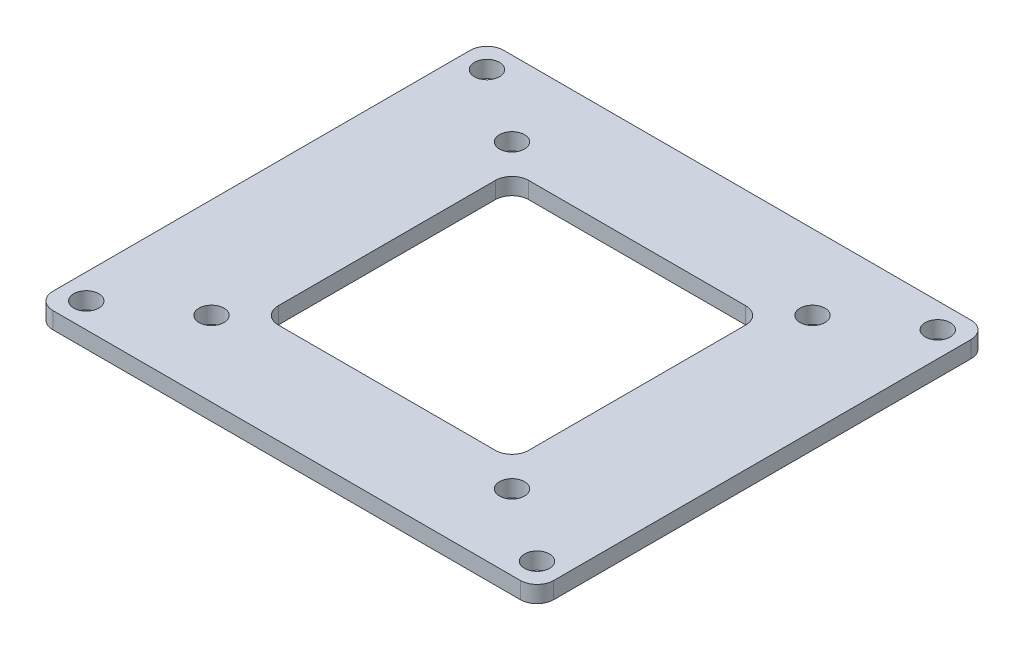
ISO-10303-21;
HEADER;
FILE_DESCRIPTION(('STEP AP214'),'2;1');
FILE_NAME('part.step','',(''),(''),'','','');
FILE_SCHEMA(('AUTOMOTIVE_DESIGN { 1 0 10303 214 1 1 1 1 }'));
ENDSEC;
DATA;
#1=APPLICATION_CONTEXT('core data for automotive mechanical design processes');
#2=APPLICATION_PROTOCOL_DEFINITION('international standard','automotive_design',2000,#1);
#3=PRODUCT_CONTEXT('',#1,'mechanical');
#4=PRODUCT('Part','Part','',(#3));
#5=PRODUCT_RELATED_PRODUCT_CATEGORY('part','',(#4));
#6=PRODUCT_DEFINITION_FORMATION('','',#4);
#7=PRODUCT_DEFINITION_CONTEXT('part definition',#1,'design');
#8=PRODUCT_DEFINITION('design','',#6,#7);
#9=PRODUCT_DEFINITION_SHAPE('','',#8);
#10=(LENGTH_UNIT() NAMED_UNIT(*) SI_UNIT(.MILLI.,.METRE.));
#11=(NAMED_UNIT(*) PLANE_ANGLE_UNIT() SI_UNIT($,.RADIAN.));
#12=(NAMED_UNIT(*) SI_UNIT($,.STERADIAN.) SOLID_ANGLE_UNIT());
#13=UNCERTAINTY_MEASURE_WITH_UNIT(LENGTH_MEASURE(1.E-05),#10,'distance_accuracy_value','');
#14=(GEOMETRIC_REPRESENTATION_CONTEXT(3) GLOBAL_UNCERTAINTY_ASSIGNED_CONTEXT((#13)) GLOBAL_UNIT_ASSIGNED_CONTEXT((#10,
#11,#12)) REPRESENTATION_CONTEXT('',''));
#15=CARTESIAN_POINT('',(0.,0.,0.));
#16=DIRECTION('',(0.,0.,1.));
#17=DIRECTION('',(1.,0.,0.));
#18=AXIS2_PLACEMENT_3D('',#15,#16,#17);
#19=CARTESIAN_POINT('',(0.,2.,0.));
#20=DIRECTION('',(0.,1.,0.));
#21=DIRECTION('',(0.,0.,1.));
#22=AXIS2_PLACEMENT_3D('',#19,#20,#21);
#23=PLANE('',#22);
#24=DIRECTION('',(0.,0.,-1.));
#25=VECTOR('',#24,1.);
#26=CARTESIAN_POINT('',(15.,2.,-15.));
#27=LINE('',#26,#25);
#28=CARTESIAN_POINT('',(15.,2.,13.));
#29=VERTEX_POINT('',#28);
#30=CARTESIAN_POINT('',(15.,2.,-13.));
#31=VERTEX_POINT('',#30);
#32=EDGE_CURVE('E302',#29,#31,#27,.T.);
#33=ORIENTED_EDGE('',*,*,#32,.F.);
#34=CARTESIAN_POINT('',(13.,2.,13.));
#35=DIRECTION('',(0.,1.,0.));
#36=DIRECTION('',(0.,0.,1.));
#37=AXIS2_PLACEMENT_3D('',#34,#35,#36);
#38=CIRCLE('',#37,2.);
#39=CARTESIAN_POINT('',(13.,2.,15.));
#40=VERTEX_POINT('',#39);
#41=EDGE_CURVE('E272',#29,#40,#38,.F.);
#42=ORIENTED_EDGE('',*,*,#41,.T.);
#43=DIRECTION('',(1.,0.,0.));
#44=VECTOR('',#43,1.);
#45=CARTESIAN_POINT('',(-15.,2.,15.));
#46=LINE('',#45,#44);
#47=CARTESIAN_POINT('',(-13.,2.,15.));
#48=VERTEX_POINT('',#47);
#49=EDGE_CURVE('E331',#48,#40,#46,.T.);
#50=ORIENTED_EDGE('',*,*,#49,.F.);
#51=CARTESIAN_POINT('',(-13.,2.,13.));
#52=DIRECTION('',(0.,1.,0.));
#53=DIRECTION('',(0.,0.,1.));
#54=AXIS2_PLACEMENT_3D('',#51,#52,#53);
#55=CIRCLE('',#54,2.);
#56=CARTESIAN_POINT('',(-15.,2.,13.));
#57=VERTEX_POINT('',#56);
#58=EDGE_CURVE('E278',#48,#57,#55,.F.);
#59=ORIENTED_EDGE('',*,*,#58,.T.);
#60=DIRECTION('',(0.,0.,1.));
#61=VECTOR('',#60,1.);
#62=CARTESIAN_POINT('',(-15.,2.,-15.));
#63=LINE('',#62,#61);
#64=CARTESIAN_POINT('',(-15.,2.,-13.));
#65=VERTEX_POINT('',#64);
#66=EDGE_CURVE('E296',#65,#57,#63,.T.);
#67=ORIENTED_EDGE('',*,*,#66,.F.);
#68=CARTESIAN_POINT('',(-13.,2.,-13.));
#69=DIRECTION('',(0.,1.,0.));
#70=DIRECTION('',(0.,0.,1.));
#71=AXIS2_PLACEMENT_3D('',#68,#69,#70);
#72=CIRCLE('',#71,2.);
#73=CARTESIAN_POINT('',(-13.,2.,-15.));
#74=VERTEX_POINT('',#73);
#75=EDGE_CURVE('E48',#65,#74,#72,.F.);
#76=ORIENTED_EDGE('',*,*,#75,.T.);
#77=DIRECTION('',(-1.,0.,0.));
#78=VECTOR('',#77,1.);
#79=CARTESIAN_POINT('',(-15.,2.,-15.));
#80=LINE('',#79,#78);
#81=CARTESIAN_POINT('',(13.,2.,-15.));
#82=VERTEX_POINT('',#81);
#83=EDGE_CURVE('E294',#82,#74,#80,.T.);
#84=ORIENTED_EDGE('',*,*,#83,.F.);
#85=CARTESIAN_POINT('',(13.,2.,-13.));
#86=DIRECTION('',(0.,1.,0.));
#87=DIRECTION('',(0.,0.,1.));
#88=AXIS2_PLACEMENT_3D('',#85,#86,#87);
#89=CIRCLE('',#88,2.);
#90=EDGE_CURVE('E284',#82,#31,#89,.F.);
#91=ORIENTED_EDGE('',*,*,#90,.T.);
#92=EDGE_LOOP('',(#33,#42,#50,#59,#67,#76,#84,#91));
#93=FACE_BOUND('',#92,.T.);
#94=CARTESIAN_POINT('',(-18.,2.,-18.));
#95=DIRECTION('',(0.,1.,0.));
#96=DIRECTION('',(0.,0.,-1.));
#97=AXIS2_PLACEMENT_3D('',#94,#95,#96);
#98=CIRCLE('',#97,1.5);
#99=CARTESIAN_POINT('',(-18.,2.,-19.5));
#100=VERTEX_POINT('',#99);
#101=EDGE_CURVE('E348',#100,#100,#98,.T.);
#102=ORIENTED_EDGE('',*,*,#101,.F.);
#103=EDGE_LOOP('',(#102));
#104=FACE_BOUND('',#103,.T.);
#105=CARTESIAN_POINT('',(18.,2.,18.));
#106=DIRECTION('',(0.,1.,0.));
#107=DIRECTION('',(0.,0.,-1.));
#108=AXIS2_PLACEMENT_3D('',#105,#106,#107);
#109=CIRCLE('',#108,1.5);
#110=CARTESIAN_POINT('',(18.,2.,16.5));
#111=VERTEX_POINT('',#110);
#112=EDGE_CURVE('E339',#111,#111,#109,.T.);
#113=ORIENTED_EDGE('',*,*,#112,.F.);
#114=EDGE_LOOP('',(#113));
#115=FACE_BOUND('',#114,.T.);
#116=CARTESIAN_POINT('',(-18.,2.,18.));
#117=DIRECTION('',(0.,1.,0.));
#118=DIRECTION('',(0.,0.,1.));
#119=AXIS2_PLACEMENT_3D('',#116,#117,#118);
#120=CIRCLE('',#119,1.5);
#121=CARTESIAN_POINT('',(-18.,2.,19.5));
#122=VERTEX_POINT('',#121);
#123=EDGE_CURVE('E320',#122,#122,#120,.T.);
#124=ORIENTED_EDGE('',*,*,#123,.F.);
#125=EDGE_LOOP('',(#124));
#126=FACE_BOUND('',#125,.T.);
#127=CARTESIAN_POINT('',(18.,2.,-18.));
#128=DIRECTION('',(0.,1.,0.));
#129=DIRECTION('',(0.,0.,1.));
#130=AXIS2_PLACEMENT_3D('',#127,#128,#129);
#131=CIRCLE('',#130,1.5);
#132=CARTESIAN_POINT('',(18.,2.,-16.5));
#133=VERTEX_POINT('',#132);
#134=EDGE_CURVE('E347',#133,#133,#131,.T.);
#135=ORIENTED_EDGE('',*,*,#134,.F.);
#136=EDGE_LOOP('',(#135));
#137=FACE_BOUND('',#136,.T.);
#138=CARTESIAN_POINT('',(-27.,2.,24.));
#139=DIRECTION('',(0.,1.,0.));
#140=DIRECTION('',(0.,0.,1.));
#141=AXIS2_PLACEMENT_3D('',#138,#139,#140);
#142=CIRCLE('',#141,1.5);
#143=CARTESIAN_POINT('',(-27.,2.,25.5));
#144=VERTEX_POINT('',#143);
#145=EDGE_CURVE('E375',#144,#144,#142,.T.);
#146=ORIENTED_EDGE('',*,*,#145,.F.);
#147=EDGE_LOOP('',(#146));
#148=FACE_BOUND('',#147,.T.);
#149=CARTESIAN_POINT('',(27.,2.,-24.));
#150=DIRECTION('',(0.,1.,0.));
#151=DIRECTION('',(0.,0.,1.));
#152=AXIS2_PLACEMENT_3D('',#149,#150,#151);
#153=CIRCLE('',#152,1.5);
#154=CARTESIAN_POINT('',(27.,2.,-22.5));
#155=VERTEX_POINT('',#154);
#156=EDGE_CURVE('E186',#155,#155,#153,.T.);
#157=ORIENTED_EDGE('',*,*,#156,.F.);
#158=EDGE_LOOP('',(#157));
#159=FACE_BOUND('',#158,.T.);
#160=DIRECTION('',(1.,0.,0.));
#161=VECTOR('',#160,1.);
#162=CARTESIAN_POINT('',(-30.,2.,27.));
#163=LINE('',#162,#161);
#164=CARTESIAN_POINT('',(-28.,2.,27.));
#165=VERTEX_POINT('',#164);
#166=CARTESIAN_POINT('',(28.,2.,27.));
#167=VERTEX_POINT('',#166);
#168=EDGE_CURVE('E197',#165,#167,#163,.T.);
#169=ORIENTED_EDGE('',*,*,#168,.T.);
#170=CARTESIAN_POINT('',(28.,2.,25.));
#171=DIRECTION('',(0.,1.,0.));
#172=DIRECTION('',(0.,0.,1.));
#173=AXIS2_PLACEMENT_3D('',#170,#171,#172);
#174=CIRCLE('',#173,2.);
#175=CARTESIAN_POINT('',(30.,2.,25.));
#176=VERTEX_POINT('',#175);
#177=EDGE_CURVE('E228',#167,#176,#174,.T.);
#178=ORIENTED_EDGE('',*,*,#177,.T.);
#179=DIRECTION('',(0.,0.,-1.));
#180=VECTOR('',#179,1.);
#181=CARTESIAN_POINT('',(30.,2.,-27.));
#182=LINE('',#181,#180);
#183=CARTESIAN_POINT('',(30.,2.,-25.));
#184=VERTEX_POINT('',#183);
#185=EDGE_CURVE('E175',#176,#184,#182,.T.);
#186=ORIENTED_EDGE('',*,*,#185,.T.);
#187=CARTESIAN_POINT('',(28.,2.,-25.));
#188=DIRECTION('',(0.,1.,0.));
#189=DIRECTION('',(0.,0.,1.));
#190=AXIS2_PLACEMENT_3D('',#187,#188,#189);
#191=CIRCLE('',#190,2.);
#192=CARTESIAN_POINT('',(28.,2.,-27.));
#193=VERTEX_POINT('',#192);
#194=EDGE_CURVE('E222',#184,#193,#191,.T.);
#195=ORIENTED_EDGE('',*,*,#194,.T.);
#196=DIRECTION('',(-1.,0.,0.));
#197=VECTOR('',#196,1.);
#198=CARTESIAN_POINT('',(-30.,2.,-27.));
#199=LINE('',#198,#197);
#200=CARTESIAN_POINT('',(-28.,2.,-27.));
#201=VERTEX_POINT('',#200);
#202=EDGE_CURVE('E395',#193,#201,#199,.T.);
#203=ORIENTED_EDGE('',*,*,#202,.T.);
#204=CARTESIAN_POINT('',(-28.,2.,-25.));
#205=DIRECTION('',(0.,1.,0.));
#206=DIRECTION('',(0.,0.,1.));
#207=AXIS2_PLACEMENT_3D('',#204,#205,#206);
#208=CIRCLE('',#207,2.);
#209=CARTESIAN_POINT('',(-30.,2.,-25.));
#210=VERTEX_POINT('',#209);
#211=EDGE_CURVE('E219',#201,#210,#208,.T.);
#212=ORIENTED_EDGE('',*,*,#211,.T.);
#213=DIRECTION('',(0.,0.,1.));
#214=VECTOR('',#213,1.);
#215=CARTESIAN_POINT('',(-30.,2.,-27.));
#216=LINE('',#215,#214);
#217=CARTESIAN_POINT('',(-30.,2.,25.));
#218=VERTEX_POINT('',#217);
#219=EDGE_CURVE('E398',#210,#218,#216,.T.);
#220=ORIENTED_EDGE('',*,*,#219,.T.);
#221=CARTESIAN_POINT('',(-28.,2.,25.));
#222=DIRECTION('',(0.,1.,0.));
#223=DIRECTION('',(0.,0.,1.));
#224=AXIS2_PLACEMENT_3D('',#221,#222,#223);
#225=CIRCLE('',#224,2.);
#226=EDGE_CURVE('E225',#218,#165,#225,.T.);
#227=ORIENTED_EDGE('',*,*,#226,.T.);
#228=EDGE_LOOP('',(#169,#178,#186,#195,#203,#212,#220,#227));
#229=FACE_BOUND('',#228,.T.);
#230=CARTESIAN_POINT('',(-27.,2.,-24.));
#231=DIRECTION('',(0.,1.,0.));
#232=DIRECTION('',(0.,0.,-1.));
#233=AXIS2_PLACEMENT_3D('',#230,#231,#232);
#234=CIRCLE('',#233,1.5);
#235=CARTESIAN_POINT('',(-27.,2.,-25.5));
#236=VERTEX_POINT('',#235);
#237=EDGE_CURVE('E383',#236,#236,#234,.T.);
#238=ORIENTED_EDGE('',*,*,#237,.F.);
#239=EDGE_LOOP('',(#238));
#240=FACE_BOUND('',#239,.T.);
#241=CARTESIAN_POINT('',(27.,2.,24.));
#242=DIRECTION('',(0.,1.,0.));
#243=DIRECTION('',(0.,0.,-1.));
#244=AXIS2_PLACEMENT_3D('',#241,#242,#243);
#245=CIRCLE('',#244,1.5);
#246=CARTESIAN_POINT('',(27.,2.,22.5));
#247=VERTEX_POINT('',#246);
#248=EDGE_CURVE('E367',#247,#247,#245,.T.);
#249=ORIENTED_EDGE('',*,*,#248,.F.);
#250=EDGE_LOOP('',(#249));
#251=FACE_BOUND('',#250,.T.);
#252=ADVANCED_FACE('F39',(#93,#104,#115,#126,#137,#148,#159,#229,#240,#251),#23,.T.);
#253=CARTESIAN_POINT('',(0.,0.,0.));
#254=DIRECTION('',(0.,1.,0.));
#255=DIRECTION('',(0.,0.,1.));
#256=AXIS2_PLACEMENT_3D('',#253,#254,#255);
#257=PLANE('',#256);
#258=DIRECTION('',(0.,0.,1.));
#259=VECTOR('',#258,1.);
#260=CARTESIAN_POINT('',(-15.,0.,-15.));
#261=LINE('',#260,#259);
#262=CARTESIAN_POINT('',(-15.,0.,-13.));
#263=VERTEX_POINT('',#262);
#264=CARTESIAN_POINT('',(-15.,0.,13.));
#265=VERTEX_POINT('',#264);
#266=EDGE_CURVE('E308',#263,#265,#261,.T.);
#267=ORIENTED_EDGE('',*,*,#266,.T.);
#268=CARTESIAN_POINT('',(-13.,0.,13.));
#269=DIRECTION('',(0.,1.,0.));
#270=DIRECTION('',(0.,0.,1.));
#271=AXIS2_PLACEMENT_3D('',#268,#269,#270);
#272=CIRCLE('',#271,2.);
#273=CARTESIAN_POINT('',(-13.,0.,15.));
#274=VERTEX_POINT('',#273);
#275=EDGE_CURVE('E281',#265,#274,#272,.T.);
#276=ORIENTED_EDGE('',*,*,#275,.T.);
#277=DIRECTION('',(1.,0.,0.));
#278=VECTOR('',#277,1.);
#279=CARTESIAN_POINT('',(-15.,0.,15.));
#280=LINE('',#279,#278);
#281=CARTESIAN_POINT('',(13.,0.,15.));
#282=VERTEX_POINT('',#281);
#283=EDGE_CURVE('E315',#274,#282,#280,.T.);
#284=ORIENTED_EDGE('',*,*,#283,.T.);
#285=CARTESIAN_POINT('',(13.,0.,13.));
#286=DIRECTION('',(0.,1.,0.));
#287=DIRECTION('',(0.,0.,1.));
#288=AXIS2_PLACEMENT_3D('',#285,#286,#287);
#289=CIRCLE('',#288,2.);
#290=CARTESIAN_POINT('',(15.,0.,13.));
#291=VERTEX_POINT('',#290);
#292=EDGE_CURVE('E275',#282,#291,#289,.T.);
#293=ORIENTED_EDGE('',*,*,#292,.T.);
#294=DIRECTION('',(0.,0.,-1.));
#295=VECTOR('',#294,1.);
#296=CARTESIAN_POINT('',(15.,0.,-15.));
#297=LINE('',#296,#295);
#298=CARTESIAN_POINT('',(15.,0.,-13.));
#299=VERTEX_POINT('',#298);
#300=EDGE_CURVE('E322',#291,#299,#297,.T.);
#301=ORIENTED_EDGE('',*,*,#300,.T.);
#302=CARTESIAN_POINT('',(13.,0.,-13.));
#303=DIRECTION('',(0.,1.,0.));
#304=DIRECTION('',(0.,0.,1.));
#305=AXIS2_PLACEMENT_3D('',#302,#303,#304);
#306=CIRCLE('',#305,2.);
#307=CARTESIAN_POINT('',(13.,0.,-15.));
#308=VERTEX_POINT('',#307);
#309=EDGE_CURVE('E62',#299,#308,#306,.T.);
#310=ORIENTED_EDGE('',*,*,#309,.T.);
#311=DIRECTION('',(-1.,0.,0.));
#312=VECTOR('',#311,1.);
#313=CARTESIAN_POINT('',(-15.,0.,-15.));
#314=LINE('',#313,#312);
#315=CARTESIAN_POINT('',(-13.,0.,-15.));
#316=VERTEX_POINT('',#315);
#317=EDGE_CURVE('E310',#308,#316,#314,.T.);
#318=ORIENTED_EDGE('',*,*,#317,.T.);
#319=CARTESIAN_POINT('',(-13.,0.,-13.));
#320=DIRECTION('',(0.,1.,0.));
#321=DIRECTION('',(0.,0.,1.));
#322=AXIS2_PLACEMENT_3D('',#319,#320,#321);
#323=CIRCLE('',#322,2.);
#324=EDGE_CURVE('E11',#316,#263,#323,.T.);
#325=ORIENTED_EDGE('',*,*,#324,.T.);
#326=EDGE_LOOP('',(#267,#276,#284,#293,#301,#310,#318,#325));
#327=FACE_BOUND('',#326,.T.);
#328=CARTESIAN_POINT('',(-18.,0.,-18.));
#329=DIRECTION('',(0.,1.,0.));
#330=DIRECTION('',(0.,0.,-1.));
#331=AXIS2_PLACEMENT_3D('',#328,#329,#330);
#332=CIRCLE('',#331,1.5);
#333=CARTESIAN_POINT('',(-18.,0.,-19.5));
#334=VERTEX_POINT('',#333);
#335=EDGE_CURVE('E343',#334,#334,#332,.T.);
#336=ORIENTED_EDGE('',*,*,#335,.T.);
#337=EDGE_LOOP('',(#336));
#338=FACE_BOUND('',#337,.T.);
#339=CARTESIAN_POINT('',(18.,0.,18.));
#340=DIRECTION('',(0.,1.,0.));
#341=DIRECTION('',(0.,0.,-1.));
#342=AXIS2_PLACEMENT_3D('',#339,#340,#341);
#343=CIRCLE('',#342,1.5);
#344=CARTESIAN_POINT('',(18.,0.,16.5));
#345=VERTEX_POINT('',#344);
#346=EDGE_CURVE('E352',#345,#345,#343,.T.);
#347=ORIENTED_EDGE('',*,*,#346,.T.);
#348=EDGE_LOOP('',(#347));
#349=FACE_BOUND('',#348,.T.);
#350=CARTESIAN_POINT('',(-18.,0.,18.));
#351=DIRECTION('',(0.,1.,0.));
#352=DIRECTION('',(0.,0.,1.));
#353=AXIS2_PLACEMENT_3D('',#350,#351,#352);
#354=CIRCLE('',#353,1.5);
#355=CARTESIAN_POINT('',(-18.,0.,19.5));
#356=VERTEX_POINT('',#355);
#357=EDGE_CURVE('E335',#356,#356,#354,.T.);
#358=ORIENTED_EDGE('',*,*,#357,.T.);
#359=EDGE_LOOP('',(#358));
#360=FACE_BOUND('',#359,.T.);
#361=CARTESIAN_POINT('',(18.,0.,-18.));
#362=DIRECTION('',(0.,1.,0.));
#363=DIRECTION('',(0.,0.,1.));
#364=AXIS2_PLACEMENT_3D('',#361,#362,#363);
#365=CIRCLE('',#364,1.5);
#366=CARTESIAN_POINT('',(18.,0.,-16.5));
#367=VERTEX_POINT('',#366);
#368=EDGE_CURVE('E359',#367,#367,#365,.T.);
#369=ORIENTED_EDGE('',*,*,#368,.T.);
#370=EDGE_LOOP('',(#369));
#371=FACE_BOUND('',#370,.T.);
#372=DIRECTION('',(0.,0.,-1.));
#373=VECTOR('',#372,1.);
#374=CARTESIAN_POINT('',(30.,0.,-27.));
#375=LINE('',#374,#373);
#376=CARTESIAN_POINT('',(30.,0.,25.));
#377=VERTEX_POINT('',#376);
#378=CARTESIAN_POINT('',(30.,0.,-25.));
#379=VERTEX_POINT('',#378);
#380=EDGE_CURVE('E172',#377,#379,#375,.T.);
#381=ORIENTED_EDGE('',*,*,#380,.F.);
#382=CARTESIAN_POINT('',(28.,0.,25.));
#383=DIRECTION('',(0.,1.,0.));
#384=DIRECTION('',(0.,0.,1.));
#385=AXIS2_PLACEMENT_3D('',#382,#383,#384);
#386=CIRCLE('',#385,2.);
#387=CARTESIAN_POINT('',(28.,0.,27.));
#388=VERTEX_POINT('',#387);
#389=EDGE_CURVE('E154',#377,#388,#386,.F.);
#390=ORIENTED_EDGE('',*,*,#389,.T.);
#391=DIRECTION('',(1.,0.,0.));
#392=VECTOR('',#391,1.);
#393=CARTESIAN_POINT('',(-30.,0.,27.));
#394=LINE('',#393,#392);
#395=CARTESIAN_POINT('',(-28.,0.,27.));
#396=VERTEX_POINT('',#395);
#397=EDGE_CURVE('E203',#396,#388,#394,.T.);
#398=ORIENTED_EDGE('',*,*,#397,.F.);
#399=CARTESIAN_POINT('',(-28.,0.,25.));
#400=DIRECTION('',(0.,1.,0.));
#401=DIRECTION('',(0.,0.,1.));
#402=AXIS2_PLACEMENT_3D('',#399,#400,#401);
#403=CIRCLE('',#402,2.);
#404=CARTESIAN_POINT('',(-30.,0.,25.));
#405=VERTEX_POINT('',#404);
#406=EDGE_CURVE('E166',#396,#405,#403,.F.);
#407=ORIENTED_EDGE('',*,*,#406,.T.);
#408=DIRECTION('',(0.,0.,1.));
#409=VECTOR('',#408,1.);
#410=CARTESIAN_POINT('',(-30.,0.,-27.));
#411=LINE('',#410,#409);
#412=CARTESIAN_POINT('',(-30.,0.,-25.));
#413=VERTEX_POINT('',#412);
#414=EDGE_CURVE('E191',#413,#405,#411,.T.);
#415=ORIENTED_EDGE('',*,*,#414,.F.);
#416=CARTESIAN_POINT('',(-28.,0.,-25.));
#417=DIRECTION('',(0.,1.,0.));
#418=DIRECTION('',(0.,0.,1.));
#419=AXIS2_PLACEMENT_3D('',#416,#417,#418);
#420=CIRCLE('',#419,2.);
#421=CARTESIAN_POINT('',(-28.,0.,-27.));
#422=VERTEX_POINT('',#421);
#423=EDGE_CURVE('E177',#413,#422,#420,.F.);
#424=ORIENTED_EDGE('',*,*,#423,.T.);
#425=DIRECTION('',(-1.,0.,0.));
#426=VECTOR('',#425,1.);
#427=CARTESIAN_POINT('',(-30.,0.,-27.));
#428=LINE('',#427,#426);
#429=CARTESIAN_POINT('',(28.,0.,-27.));
#430=VERTEX_POINT('',#429);
#431=EDGE_CURVE('E185',#430,#422,#428,.T.);
#432=ORIENTED_EDGE('',*,*,#431,.F.);
#433=CARTESIAN_POINT('',(28.,0.,-25.));
#434=DIRECTION('',(0.,1.,0.));
#435=DIRECTION('',(0.,0.,1.));
#436=AXIS2_PLACEMENT_3D('',#433,#434,#435);
#437=CIRCLE('',#436,2.);
#438=EDGE_CURVE('E183',#430,#379,#437,.F.);
#439=ORIENTED_EDGE('',*,*,#438,.T.);
#440=EDGE_LOOP('',(#381,#390,#398,#407,#415,#424,#432,#439));
#441=FACE_BOUND('',#440,.T.);
#442=CARTESIAN_POINT('',(27.,0.,-24.));
#443=DIRECTION('',(0.,1.,0.));
#444=DIRECTION('',(0.,0.,1.));
#445=AXIS2_PLACEMENT_3D('',#442,#443,#444);
#446=CIRCLE('',#445,1.5);
#447=CARTESIAN_POINT('',(27.,0.,-22.5));
#448=VERTEX_POINT('',#447);
#449=EDGE_CURVE('E194',#448,#448,#446,.T.);
#450=ORIENTED_EDGE('',*,*,#449,.T.);
#451=EDGE_LOOP('',(#450));
#452=FACE_BOUND('',#451,.T.);
#453=CARTESIAN_POINT('',(-27.,0.,-24.));
#454=DIRECTION('',(0.,1.,0.));
#455=DIRECTION('',(0.,0.,-1.));
#456=AXIS2_PLACEMENT_3D('',#453,#454,#455);
#457=CIRCLE('',#456,1.5);
#458=CARTESIAN_POINT('',(-27.,0.,-25.5));
#459=VERTEX_POINT('',#458);
#460=EDGE_CURVE('E379',#459,#459,#457,.T.);
#461=ORIENTED_EDGE('',*,*,#460,.T.);
#462=EDGE_LOOP('',(#461));
#463=FACE_BOUND('',#462,.T.);
#464=CARTESIAN_POINT('',(-27.,0.,24.));
#465=DIRECTION('',(0.,1.,0.));
#466=DIRECTION('',(0.,0.,1.));
#467=AXIS2_PLACEMENT_3D('',#464,#465,#466);
#468=CIRCLE('',#467,1.5);
#469=CARTESIAN_POINT('',(-27.,0.,25.5));
#470=VERTEX_POINT('',#469);
#471=EDGE_CURVE('E371',#470,#470,#468,.T.);
#472=ORIENTED_EDGE('',*,*,#471,.T.);
#473=EDGE_LOOP('',(#472));
#474=FACE_BOUND('',#473,.T.);
#475=CARTESIAN_POINT('',(27.,0.,24.));
#476=DIRECTION('',(0.,1.,0.));
#477=DIRECTION('',(0.,0.,-1.));
#478=AXIS2_PLACEMENT_3D('',#475,#476,#477);
#479=CIRCLE('',#478,1.5);
#480=CARTESIAN_POINT('',(27.,0.,22.5));
#481=VERTEX_POINT('',#480);
#482=EDGE_CURVE('E363',#481,#481,#479,.T.);
#483=ORIENTED_EDGE('',*,*,#482,.T.);
#484=EDGE_LOOP('',(#483));
#485=FACE_BOUND('',#484,.T.);
#486=ADVANCED_FACE('F180',(#327,#338,#349,#360,#371,#441,#452,#463,#474,#485),#257,.F.);
#487=CARTESIAN_POINT('',(30.,2.,-27.));
#488=DIRECTION('',(-1.,0.,0.));
#489=DIRECTION('',(0.,0.,1.));
#490=AXIS2_PLACEMENT_3D('',#487,#488,#489);
#491=PLANE('',#490);
#492=ORIENTED_EDGE('',*,*,#185,.F.);
#493=DIRECTION('',(0.,-1.,0.));
#494=VECTOR('',#493,1.);
#495=CARTESIAN_POINT('',(30.,2.,25.));
#496=LINE('',#495,#494);
#497=EDGE_CURVE('E158',#176,#377,#496,.T.);
#498=ORIENTED_EDGE('',*,*,#497,.T.);
#499=ORIENTED_EDGE('',*,*,#380,.T.);
#500=DIRECTION('',(0.,-1.,0.));
#501=VECTOR('',#500,1.);
#502=CARTESIAN_POINT('',(30.,2.,-25.));
#503=LINE('',#502,#501);
#504=EDGE_CURVE('E178',#379,#184,#503,.F.);
#505=ORIENTED_EDGE('',*,*,#504,.T.);
#506=EDGE_LOOP('',(#492,#498,#499,#505));
#507=FACE_BOUND('',#506,.T.);
#508=ADVANCED_FACE('F171',(#507),#491,.F.);
#509=CARTESIAN_POINT('',(-30.,2.,-27.));
#510=DIRECTION('',(0.,0.,1.));
#511=DIRECTION('',(1.,0.,0.));
#512=AXIS2_PLACEMENT_3D('',#509,#510,#511);
#513=PLANE('',#512);
#514=ORIENTED_EDGE('',*,*,#202,.F.);
#515=DIRECTION('',(0.,-1.,0.));
#516=VECTOR('',#515,1.);
#517=CARTESIAN_POINT('',(28.,2.,-27.));
#518=LINE('',#517,#516);
#519=EDGE_CURVE('E241',#193,#430,#518,.T.);
#520=ORIENTED_EDGE('',*,*,#519,.T.);
#521=ORIENTED_EDGE('',*,*,#431,.T.);
#522=DIRECTION('',(0.,-1.,0.));
#523=VECTOR('',#522,1.);
#524=CARTESIAN_POINT('',(-28.,2.,-27.));
#525=LINE('',#524,#523);
#526=EDGE_CURVE('E238',#422,#201,#525,.F.);
#527=ORIENTED_EDGE('',*,*,#526,.T.);
#528=EDGE_LOOP('',(#514,#520,#521,#527));
#529=FACE_BOUND('',#528,.T.);
#530=ADVANCED_FACE('F424',(#529),#513,.F.);
#531=CARTESIAN_POINT('',(-30.,2.,-27.));
#532=DIRECTION('',(1.,0.,0.));
#533=DIRECTION('',(0.,0.,-1.));
#534=AXIS2_PLACEMENT_3D('',#531,#532,#533);
#535=PLANE('',#534);
#536=ORIENTED_EDGE('',*,*,#414,.T.);
#537=DIRECTION('',(0.,-1.,0.));
#538=VECTOR('',#537,1.);
#539=CARTESIAN_POINT('',(-30.,2.,25.));
#540=LINE('',#539,#538);
#541=EDGE_CURVE('E235',#405,#218,#540,.F.);
#542=ORIENTED_EDGE('',*,*,#541,.T.);
#543=ORIENTED_EDGE('',*,*,#219,.F.);
#544=DIRECTION('',(0.,-1.,0.));
#545=VECTOR('',#544,1.);
#546=CARTESIAN_POINT('',(-30.,2.,-25.));
#547=LINE('',#546,#545);
#548=EDGE_CURVE('E231',#210,#413,#547,.T.);
#549=ORIENTED_EDGE('',*,*,#548,.T.);
#550=EDGE_LOOP('',(#536,#542,#543,#549));
#551=FACE_BOUND('',#550,.T.);
#552=ADVANCED_FACE('F416',(#551),#535,.F.);
#553=CARTESIAN_POINT('',(-30.,2.,27.));
#554=DIRECTION('',(0.,0.,-1.));
#555=DIRECTION('',(-1.,0.,0.));
#556=AXIS2_PLACEMENT_3D('',#553,#554,#555);
#557=PLANE('',#556);
#558=ORIENTED_EDGE('',*,*,#397,.T.);
#559=DIRECTION('',(0.,-1.,0.));
#560=VECTOR('',#559,1.);
#561=CARTESIAN_POINT('',(28.,2.,27.));
#562=LINE('',#561,#560);
#563=EDGE_CURVE('E159',#388,#167,#562,.F.);
#564=ORIENTED_EDGE('',*,*,#563,.T.);
#565=ORIENTED_EDGE('',*,*,#168,.F.);
#566=DIRECTION('',(0.,-1.,0.));
#567=VECTOR('',#566,1.);
#568=CARTESIAN_POINT('',(-28.,2.,27.));
#569=LINE('',#568,#567);
#570=EDGE_CURVE('E165',#165,#396,#569,.T.);
#571=ORIENTED_EDGE('',*,*,#570,.T.);
#572=EDGE_LOOP('',(#558,#564,#565,#571));
#573=FACE_BOUND('',#572,.T.);
#574=ADVANCED_FACE('F410',(#573),#557,.F.);
#575=CARTESIAN_POINT('',(27.,2.,-24.));
#576=DIRECTION('',(0.,-1.,0.));
#577=DIRECTION('',(0.,0.,-1.));
#578=AXIS2_PLACEMENT_3D('',#575,#576,#577);
#579=CYLINDRICAL_SURFACE('',#578,1.5);
#580=ORIENTED_EDGE('',*,*,#156,.T.);
#581=EDGE_LOOP('',(#580));
#582=FACE_BOUND('',#581,.T.);
#583=ORIENTED_EDGE('',*,*,#449,.F.);
#584=EDGE_LOOP('',(#583));
#585=FACE_BOUND('',#584,.T.);
#586=ADVANCED_FACE('F445',(#582,#585),#579,.F.);
#587=CARTESIAN_POINT('',(-27.,2.,-24.));
#588=DIRECTION('',(0.,-1.,0.));
#589=DIRECTION('',(0.,0.,-1.));
#590=AXIS2_PLACEMENT_3D('',#587,#588,#589);
#591=CYLINDRICAL_SURFACE('',#590,1.5);
#592=ORIENTED_EDGE('',*,*,#237,.T.);
#593=EDGE_LOOP('',(#592));
#594=FACE_BOUND('',#593,.T.);
#595=ORIENTED_EDGE('',*,*,#460,.F.);
#596=EDGE_LOOP('',(#595));
#597=FACE_BOUND('',#596,.T.);
#598=ADVANCED_FACE('F485',(#594,#597),#591,.F.);
#599=CARTESIAN_POINT('',(-27.,2.,24.));
#600=DIRECTION('',(0.,-1.,0.));
#601=DIRECTION('',(0.,0.,-1.));
#602=AXIS2_PLACEMENT_3D('',#599,#600,#601);
#603=CYLINDRICAL_SURFACE('',#602,1.5);
#604=ORIENTED_EDGE('',*,*,#145,.T.);
#605=EDGE_LOOP('',(#604));
#606=FACE_BOUND('',#605,.T.);
#607=ORIENTED_EDGE('',*,*,#471,.F.);
#608=EDGE_LOOP('',(#607));
#609=FACE_BOUND('',#608,.T.);
#610=ADVANCED_FACE('F482',(#606,#609),#603,.F.);
#611=CARTESIAN_POINT('',(27.,2.,24.));
#612=DIRECTION('',(0.,-1.,0.));
#613=DIRECTION('',(0.,0.,-1.));
#614=AXIS2_PLACEMENT_3D('',#611,#612,#613);
#615=CYLINDRICAL_SURFACE('',#614,1.5);
#616=ORIENTED_EDGE('',*,*,#248,.T.);
#617=EDGE_LOOP('',(#616));
#618=FACE_BOUND('',#617,.T.);
#619=ORIENTED_EDGE('',*,*,#482,.F.);
#620=EDGE_LOOP('',(#619));
#621=FACE_BOUND('',#620,.T.);
#622=ADVANCED_FACE('F478',(#618,#621),#615,.F.);
#623=CARTESIAN_POINT('',(18.,0.,-18.));
#624=DIRECTION('',(0.,1.,0.));
#625=DIRECTION('',(0.,0.,1.));
#626=AXIS2_PLACEMENT_3D('',#623,#624,#625);
#627=CYLINDRICAL_SURFACE('',#626,1.5);
#628=ORIENTED_EDGE('',*,*,#368,.F.);
#629=EDGE_LOOP('',(#628));
#630=FACE_BOUND('',#629,.T.);
#631=ORIENTED_EDGE('',*,*,#134,.T.);
#632=EDGE_LOOP('',(#631));
#633=FACE_BOUND('',#632,.T.);
#634=ADVANCED_FACE('F475',(#630,#633),#627,.F.);
#635=CARTESIAN_POINT('',(-18.,0.,18.));
#636=DIRECTION('',(0.,1.,0.));
#637=DIRECTION('',(0.,0.,1.));
#638=AXIS2_PLACEMENT_3D('',#635,#636,#637);
#639=CYLINDRICAL_SURFACE('',#638,1.5);
#640=ORIENTED_EDGE('',*,*,#357,.F.);
#641=EDGE_LOOP('',(#640));
#642=FACE_BOUND('',#641,.T.);
#643=ORIENTED_EDGE('',*,*,#123,.T.);
#644=EDGE_LOOP('',(#643));
#645=FACE_BOUND('',#644,.T.);
#646=ADVANCED_FACE('F467',(#642,#645),#639,.F.);
#647=CARTESIAN_POINT('',(18.,0.,18.));
#648=DIRECTION('',(0.,1.,0.));
#649=DIRECTION('',(0.,0.,1.));
#650=AXIS2_PLACEMENT_3D('',#647,#648,#649);
#651=CYLINDRICAL_SURFACE('',#650,1.5);
#652=ORIENTED_EDGE('',*,*,#346,.F.);
#653=EDGE_LOOP('',(#652));
#654=FACE_BOUND('',#653,.T.);
#655=ORIENTED_EDGE('',*,*,#112,.T.);
#656=EDGE_LOOP('',(#655));
#657=FACE_BOUND('',#656,.T.);
#658=ADVANCED_FACE('F461',(#654,#657),#651,.F.);
#659=CARTESIAN_POINT('',(-18.,0.,-18.));
#660=DIRECTION('',(0.,1.,0.));
#661=DIRECTION('',(0.,0.,1.));
#662=AXIS2_PLACEMENT_3D('',#659,#660,#661);
#663=CYLINDRICAL_SURFACE('',#662,1.5);
#664=ORIENTED_EDGE('',*,*,#335,.F.);
#665=EDGE_LOOP('',(#664));
#666=FACE_BOUND('',#665,.T.);
#667=ORIENTED_EDGE('',*,*,#101,.T.);
#668=EDGE_LOOP('',(#667));
#669=FACE_BOUND('',#668,.T.);
#670=ADVANCED_FACE('F457',(#666,#669),#663,.F.);
#671=CARTESIAN_POINT('',(28.,2.,25.));
#672=DIRECTION('',(0.,-1.,0.));
#673=DIRECTION('',(0.,0.,-1.));
#674=AXIS2_PLACEMENT_3D('',#671,#672,#673);
#675=CYLINDRICAL_SURFACE('',#674,2.);
#676=ORIENTED_EDGE('',*,*,#177,.F.);
#677=ORIENTED_EDGE('',*,*,#563,.F.);
#678=ORIENTED_EDGE('',*,*,#389,.F.);
#679=ORIENTED_EDGE('',*,*,#497,.F.);
#680=EDGE_LOOP('',(#676,#677,#678,#679));
#681=FACE_BOUND('',#680,.T.);
#682=ADVANCED_FACE('F157',(#681),#675,.T.);
#683=CARTESIAN_POINT('',(-28.,2.,25.));
#684=DIRECTION('',(0.,-1.,0.));
#685=DIRECTION('',(0.,0.,-1.));
#686=AXIS2_PLACEMENT_3D('',#683,#684,#685);
#687=CYLINDRICAL_SURFACE('',#686,2.);
#688=ORIENTED_EDGE('',*,*,#226,.F.);
#689=ORIENTED_EDGE('',*,*,#541,.F.);
#690=ORIENTED_EDGE('',*,*,#406,.F.);
#691=ORIENTED_EDGE('',*,*,#570,.F.);
#692=EDGE_LOOP('',(#688,#689,#690,#691));
#693=FACE_BOUND('',#692,.T.);
#694=ADVANCED_FACE('F412',(#693),#687,.T.);
#695=CARTESIAN_POINT('',(28.,2.,-25.));
#696=DIRECTION('',(0.,-1.,0.));
#697=DIRECTION('',(0.,0.,-1.));
#698=AXIS2_PLACEMENT_3D('',#695,#696,#697);
#699=CYLINDRICAL_SURFACE('',#698,2.);
#700=ORIENTED_EDGE('',*,*,#194,.F.);
#701=ORIENTED_EDGE('',*,*,#504,.F.);
#702=ORIENTED_EDGE('',*,*,#438,.F.);
#703=ORIENTED_EDGE('',*,*,#519,.F.);
#704=EDGE_LOOP('',(#700,#701,#702,#703));
#705=FACE_BOUND('',#704,.T.);
#706=ADVANCED_FACE('F428',(#705),#699,.T.);
#707=CARTESIAN_POINT('',(-28.,2.,-25.));
#708=DIRECTION('',(0.,-1.,0.));
#709=DIRECTION('',(0.,0.,-1.));
#710=AXIS2_PLACEMENT_3D('',#707,#708,#709);
#711=CYLINDRICAL_SURFACE('',#710,2.);
#712=ORIENTED_EDGE('',*,*,#211,.F.);
#713=ORIENTED_EDGE('',*,*,#526,.F.);
#714=ORIENTED_EDGE('',*,*,#423,.F.);
#715=ORIENTED_EDGE('',*,*,#548,.F.);
#716=EDGE_LOOP('',(#712,#713,#714,#715));
#717=FACE_BOUND('',#716,.T.);
#718=ADVANCED_FACE('F420',(#717),#711,.T.);
#719=CARTESIAN_POINT('',(15.,0.,-15.));
#720=DIRECTION('',(1.,0.,0.));
#721=DIRECTION('',(0.,0.,-1.));
#722=AXIS2_PLACEMENT_3D('',#719,#720,#721);
#723=PLANE('',#722);
#724=ORIENTED_EDGE('',*,*,#300,.F.);
#725=DIRECTION('',(0.,1.,0.));
#726=VECTOR('',#725,1.);
#727=CARTESIAN_POINT('',(15.,2.,13.));
#728=LINE('',#727,#726);
#729=EDGE_CURVE('E248',#291,#29,#728,.T.);
#730=ORIENTED_EDGE('',*,*,#729,.T.);
#731=ORIENTED_EDGE('',*,*,#32,.T.);
#732=DIRECTION('',(0.,1.,0.));
#733=VECTOR('',#732,1.);
#734=CARTESIAN_POINT('',(15.,0.,-13.));
#735=LINE('',#734,#733);
#736=EDGE_CURVE('E245',#31,#299,#735,.F.);
#737=ORIENTED_EDGE('',*,*,#736,.T.);
#738=EDGE_LOOP('',(#724,#730,#731,#737));
#739=FACE_BOUND('',#738,.T.);
#740=ADVANCED_FACE('F435',(#739),#723,.F.);
#741=CARTESIAN_POINT('',(-15.,0.,15.));
#742=DIRECTION('',(0.,0.,1.));
#743=DIRECTION('',(1.,0.,0.));
#744=AXIS2_PLACEMENT_3D('',#741,#742,#743);
#745=PLANE('',#744);
#746=ORIENTED_EDGE('',*,*,#49,.T.);
#747=DIRECTION('',(0.,1.,0.));
#748=VECTOR('',#747,1.);
#749=CARTESIAN_POINT('',(13.,0.,15.));
#750=LINE('',#749,#748);
#751=EDGE_CURVE('E256',#40,#282,#750,.F.);
#752=ORIENTED_EDGE('',*,*,#751,.T.);
#753=ORIENTED_EDGE('',*,*,#283,.F.);
#754=DIRECTION('',(0.,1.,0.));
#755=VECTOR('',#754,1.);
#756=CARTESIAN_POINT('',(-13.,2.,15.));
#757=LINE('',#756,#755);
#758=EDGE_CURVE('E252',#274,#48,#757,.T.);
#759=ORIENTED_EDGE('',*,*,#758,.T.);
#760=EDGE_LOOP('',(#746,#752,#753,#759));
#761=FACE_BOUND('',#760,.T.);
#762=ADVANCED_FACE('F543',(#761),#745,.F.);
#763=CARTESIAN_POINT('',(-15.,0.,-15.));
#764=DIRECTION('',(-1.,0.,0.));
#765=DIRECTION('',(0.,0.,1.));
#766=AXIS2_PLACEMENT_3D('',#763,#764,#765);
#767=PLANE('',#766);
#768=ORIENTED_EDGE('',*,*,#66,.T.);
#769=DIRECTION('',(0.,1.,0.));
#770=VECTOR('',#769,1.);
#771=CARTESIAN_POINT('',(-15.,0.,13.));
#772=LINE('',#771,#770);
#773=EDGE_CURVE('E263',#57,#265,#772,.F.);
#774=ORIENTED_EDGE('',*,*,#773,.T.);
#775=ORIENTED_EDGE('',*,*,#266,.F.);
#776=DIRECTION('',(0.,1.,0.));
#777=VECTOR('',#776,1.);
#778=CARTESIAN_POINT('',(-15.,2.,-13.));
#779=LINE('',#778,#777);
#780=EDGE_CURVE('E259',#263,#65,#779,.T.);
#781=ORIENTED_EDGE('',*,*,#780,.T.);
#782=EDGE_LOOP('',(#768,#774,#775,#781));
#783=FACE_BOUND('',#782,.T.);
#784=ADVANCED_FACE('F312',(#783),#767,.F.);
#785=CARTESIAN_POINT('',(-15.,0.,-15.));
#786=DIRECTION('',(0.,0.,-1.));
#787=DIRECTION('',(-1.,0.,0.));
#788=AXIS2_PLACEMENT_3D('',#785,#786,#787);
#789=PLANE('',#788);
#790=ORIENTED_EDGE('',*,*,#317,.F.);
#791=DIRECTION('',(0.,1.,0.));
#792=VECTOR('',#791,1.);
#793=CARTESIAN_POINT('',(13.,2.,-15.));
#794=LINE('',#793,#792);
#795=EDGE_CURVE('E268',#308,#82,#794,.T.);
#796=ORIENTED_EDGE('',*,*,#795,.T.);
#797=ORIENTED_EDGE('',*,*,#83,.T.);
#798=DIRECTION('',(0.,1.,0.));
#799=VECTOR('',#798,1.);
#800=CARTESIAN_POINT('',(-13.,0.,-15.));
#801=LINE('',#800,#799);
#802=EDGE_CURVE('E55',#74,#316,#801,.F.);
#803=ORIENTED_EDGE('',*,*,#802,.T.);
#804=EDGE_LOOP('',(#790,#796,#797,#803));
#805=FACE_BOUND('',#804,.T.);
#806=ADVANCED_FACE('F299',(#805),#789,.F.);
#807=CARTESIAN_POINT('',(13.,0.,13.));
#808=DIRECTION('',(0.,-1.,0.));
#809=DIRECTION('',(0.,0.,-1.));
#810=AXIS2_PLACEMENT_3D('',#807,#808,#809);
#811=CYLINDRICAL_SURFACE('',#810,2.);
#812=ORIENTED_EDGE('',*,*,#292,.F.);
#813=ORIENTED_EDGE('',*,*,#751,.F.);
#814=ORIENTED_EDGE('',*,*,#41,.F.);
#815=ORIENTED_EDGE('',*,*,#729,.F.);
#816=EDGE_LOOP('',(#812,#813,#814,#815));
#817=FACE_BOUND('',#816,.T.);
#818=ADVANCED_FACE('F570',(#817),#811,.F.);
#819=CARTESIAN_POINT('',(-13.,0.,13.));
#820=DIRECTION('',(0.,-1.,0.));
#821=DIRECTION('',(0.,0.,-1.));
#822=AXIS2_PLACEMENT_3D('',#819,#820,#821);
#823=CYLINDRICAL_SURFACE('',#822,2.);
#824=ORIENTED_EDGE('',*,*,#275,.F.);
#825=ORIENTED_EDGE('',*,*,#773,.F.);
#826=ORIENTED_EDGE('',*,*,#58,.F.);
#827=ORIENTED_EDGE('',*,*,#758,.F.);
#828=EDGE_LOOP('',(#824,#825,#826,#827));
#829=FACE_BOUND('',#828,.T.);
#830=ADVANCED_FACE('F579',(#829),#823,.F.);
#831=CARTESIAN_POINT('',(13.,0.,-13.));
#832=DIRECTION('',(0.,-1.,0.));
#833=DIRECTION('',(0.,0.,-1.));
#834=AXIS2_PLACEMENT_3D('',#831,#832,#833);
#835=CYLINDRICAL_SURFACE('',#834,2.);
#836=ORIENTED_EDGE('',*,*,#309,.F.);
#837=ORIENTED_EDGE('',*,*,#736,.F.);
#838=ORIENTED_EDGE('',*,*,#90,.F.);
#839=ORIENTED_EDGE('',*,*,#795,.F.);
#840=EDGE_LOOP('',(#836,#837,#838,#839));
#841=FACE_BOUND('',#840,.T.);
#842=ADVANCED_FACE('F589',(#841),#835,.F.);
#843=CARTESIAN_POINT('',(-13.,0.,-13.));
#844=DIRECTION('',(0.,-1.,0.));
#845=DIRECTION('',(0.,0.,-1.));
#846=AXIS2_PLACEMENT_3D('',#843,#844,#845);
#847=CYLINDRICAL_SURFACE('',#846,2.);
#848=ORIENTED_EDGE('',*,*,#324,.F.);
#849=ORIENTED_EDGE('',*,*,#802,.F.);
#850=ORIENTED_EDGE('',*,*,#75,.F.);
#851=ORIENTED_EDGE('',*,*,#780,.F.);
#852=EDGE_LOOP('',(#848,#849,#850,#851));
#853=FACE_BOUND('',#852,.T.);
#854=ADVANCED_FACE('F41',(#853),#847,.F.);
#855=CLOSED_SHELL('',(#252,#486,#508,#530,#552,#574,#586,#598,#610,#622,#634,#646,#658,#670,
#682,#694,#706,#718,#740,#762,#784,#806,#818,#830,#842,#854));
#856=MANIFOLD_SOLID_BREP('B2',#855);
#857=ADVANCED_BREP_SHAPE_REPRESENTATION('',(#18,#856),#14);
#858=SHAPE_DEFINITION_REPRESENTATION(#9,#857);
ENDSEC;
END-ISO-10303-21;
